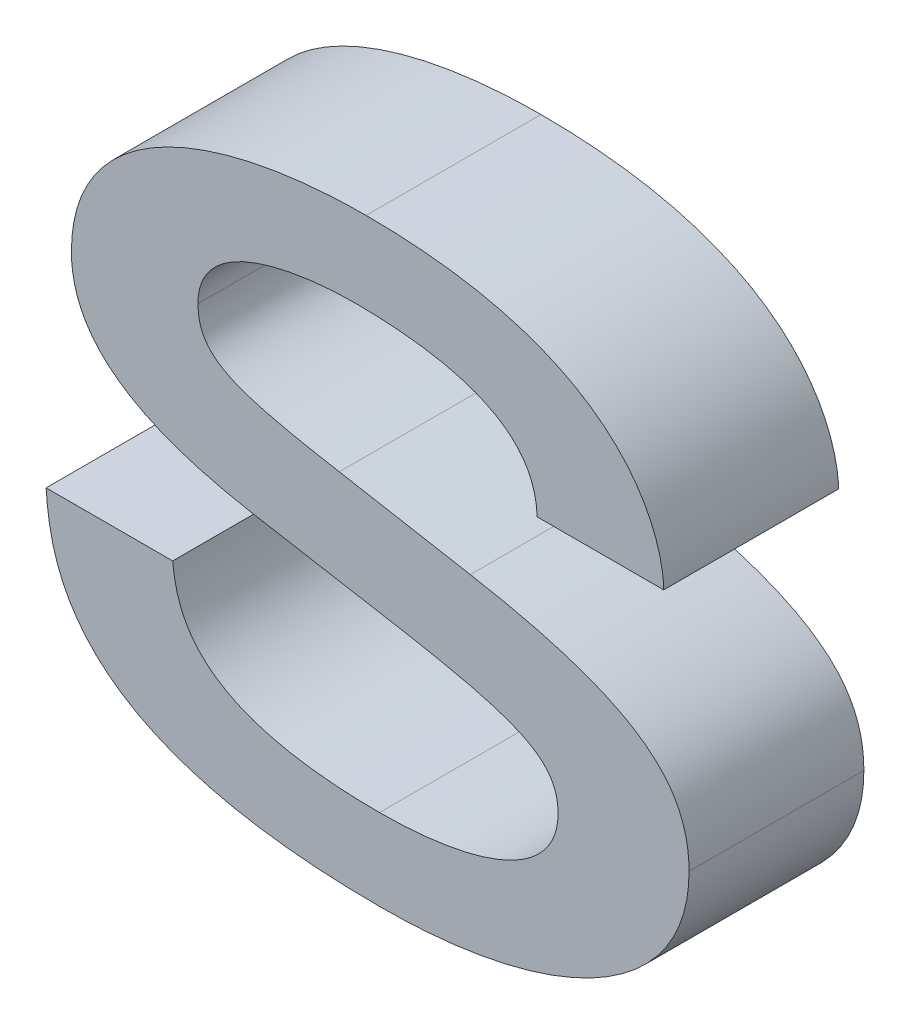
ISO-10303-21;
HEADER;
FILE_DESCRIPTION(('STEP AP214'),'2;1');
FILE_NAME('part.step','',(''),(''),'','','');
FILE_SCHEMA(('AUTOMOTIVE_DESIGN { 1 0 10303 214 1 1 1 1 }'));
ENDSEC;
DATA;
#1=APPLICATION_CONTEXT('core data for automotive mechanical design processes');
#2=APPLICATION_PROTOCOL_DEFINITION('international standard','automotive_design',2000,#1);
#3=PRODUCT_CONTEXT('',#1,'mechanical');
#4=PRODUCT('Part','Part','',(#3));
#5=PRODUCT_RELATED_PRODUCT_CATEGORY('part','',(#4));
#6=PRODUCT_DEFINITION_FORMATION('','',#4);
#7=PRODUCT_DEFINITION_CONTEXT('part definition',#1,'design');
#8=PRODUCT_DEFINITION('design','',#6,#7);
#9=PRODUCT_DEFINITION_SHAPE('','',#8);
#10=(LENGTH_UNIT() NAMED_UNIT(*) SI_UNIT(.MILLI.,.METRE.));
#11=(NAMED_UNIT(*) PLANE_ANGLE_UNIT() SI_UNIT($,.RADIAN.));
#12=(NAMED_UNIT(*) SI_UNIT($,.STERADIAN.) SOLID_ANGLE_UNIT());
#13=UNCERTAINTY_MEASURE_WITH_UNIT(LENGTH_MEASURE(1.E-05),#10,'distance_accuracy_value','');
#14=(GEOMETRIC_REPRESENTATION_CONTEXT(3) GLOBAL_UNCERTAINTY_ASSIGNED_CONTEXT((#13)) GLOBAL_UNIT_ASSIGNED_CONTEXT((#10,
#11,#12)) REPRESENTATION_CONTEXT('',''));
#15=CARTESIAN_POINT('',(0.,0.,0.));
#16=DIRECTION('',(0.,0.,1.));
#17=DIRECTION('',(1.,0.,0.));
#18=AXIS2_PLACEMENT_3D('',#15,#16,#17);
#19=CARTESIAN_POINT('',(24.202356756228,-1.164563334189,19.2));
#20=DIRECTION('',(0.,0.,-1.));
#21=DIRECTION('',(0.,-1.,0.));
#22=AXIS2_PLACEMENT_3D('',#19,#20,#21);
#23=PLANE('',#22);
#24=CARTESIAN_POINT('',(25.169579113635,-0.458206105857,19.2));
#25=CARTESIAN_POINT('',(25.16096286919,-0.256284572523,19.2));
#26=CARTESIAN_POINT('',(25.059154024746,0.0802513163659997,19.2));
#27=CARTESIAN_POINT('',(24.11443206919,0.0802513163659997,19.2));
#28=(BOUNDED_CURVE() B_SPLINE_CURVE(3,(#24,#25,#26,#27),.UNSPECIFIED.,.F.,
.F.) B_SPLINE_CURVE_WITH_KNOTS((4,4),(0.,1.),
.UNSPECIFIED.) CURVE() GEOMETRIC_REPRESENTATION_ITEM() RATIONAL_B_SPLINE_CURVE((1.,1.,1.,1.)) REPRESENTATION_ITEM(''));
#29=CARTESIAN_POINT('',(25.169579113635,-0.458207516968,19.2));
#30=VERTEX_POINT('',#29);
#31=CARTESIAN_POINT('',(24.11443206919,0.0802513163659997,19.2));
#32=VERTEX_POINT('',#31);
#33=EDGE_CURVE('E243',#30,#32,#28,.T.);
#34=ORIENTED_EDGE('',*,*,#33,.T.);
#35=CARTESIAN_POINT('',(24.11443206919,0.0802513163659997,19.2));
#36=CARTESIAN_POINT('',(23.884178246968,0.0802513163659997,19.2));
#37=CARTESIAN_POINT('',(23.228942913635,0.0251446052539999,19.2));
#38=CARTESIAN_POINT('',(23.228942913635,-0.372622216968,19.2));
#39=(BOUNDED_CURVE() B_SPLINE_CURVE(3,(#35,#36,#37,#38),.UNSPECIFIED.,.F.,
.F.) B_SPLINE_CURVE_WITH_KNOTS((4,4),(0.,1.),
.UNSPECIFIED.) CURVE() GEOMETRIC_REPRESENTATION_ITEM() RATIONAL_B_SPLINE_CURVE((1.,1.,1.,1.)) REPRESENTATION_ITEM(''));
#40=CARTESIAN_POINT('',(23.228942913635,-0.372622216968,19.2));
#41=VERTEX_POINT('',#40);
#42=EDGE_CURVE('E223',#32,#41,#39,.T.);
#43=ORIENTED_EDGE('',*,*,#42,.T.);
#44=CARTESIAN_POINT('',(23.228942913635,-0.372622216968,19.2));
#45=CARTESIAN_POINT('',(23.228942913635,-0.635935550301,19.2));
#46=CARTESIAN_POINT('',(23.458666158079,-0.696966105857,19.2));
#47=CARTESIAN_POINT('',(24.037410802523,-0.801108928079,19.2));
#48=(BOUNDED_CURVE() B_SPLINE_CURVE(3,(#44,#45,#46,#47),.UNSPECIFIED.,.F.,
.F.) B_SPLINE_CURVE_WITH_KNOTS((4,4),(0.,1.),
.UNSPECIFIED.) CURVE() GEOMETRIC_REPRESENTATION_ITEM() RATIONAL_B_SPLINE_CURVE((1.,1.,1.,1.)) REPRESENTATION_ITEM(''));
#49=CARTESIAN_POINT('',(24.037410802523,-0.801108928079,19.2));
#50=VERTEX_POINT('',#49);
#51=EDGE_CURVE('E261',#41,#50,#48,.T.);
#52=ORIENTED_EDGE('',*,*,#51,.T.);
#53=DIRECTION('',(0.98427799938062,-0.176626215311554,0.));
#54=VECTOR('',#53,1.);
#55=CARTESIAN_POINT('',(24.037410802523,-0.801108928079,19.2));
#56=LINE('',#55,#54);
#57=CARTESIAN_POINT('',(24.786753135857,-0.935576528079,19.2));
#58=VERTEX_POINT('',#57);
#59=EDGE_CURVE('E217',#50,#58,#56,.T.);
#60=ORIENTED_EDGE('',*,*,#59,.T.);
#61=CARTESIAN_POINT('',(24.786753135857,-0.935576528079,19.2));
#62=CARTESIAN_POINT('',(25.714524824746,-1.100809172523,19.2));
#63=CARTESIAN_POINT('',(26.037965602523,-1.345778061412,19.2));
#64=CARTESIAN_POINT('',(26.037965602523,-1.780233772523,19.2));
#65=(BOUNDED_CURVE() B_SPLINE_CURVE(3,(#61,#62,#63,#64),.UNSPECIFIED.,.F.,
.F.) B_SPLINE_CURVE_WITH_KNOTS((4,4),(0.,1.),
.UNSPECIFIED.) CURVE() GEOMETRIC_REPRESENTATION_ITEM() RATIONAL_B_SPLINE_CURVE((1.,1.,1.,1.)) REPRESENTATION_ITEM(''));
#66=CARTESIAN_POINT('',(26.037965602523,-1.780233772523,19.2));
#67=VERTEX_POINT('',#66);
#68=EDGE_CURVE('E275',#58,#67,#65,.T.);
#69=ORIENTED_EDGE('',*,*,#68,.T.);
#70=CARTESIAN_POINT('',(26.037965602523,-1.780233772523,19.2));
#71=CARTESIAN_POINT('',(26.037965602523,-2.44117563919,19.2));
#72=CARTESIAN_POINT('',(25.280664602523,-2.839108972523,19.2));
#73=CARTESIAN_POINT('',(24.275877291412,-2.839108972523,19.2));
#74=(BOUNDED_CURVE() B_SPLINE_CURVE(3,(#70,#71,#72,#73),.UNSPECIFIED.,.F.,
.F.) B_SPLINE_CURVE_WITH_KNOTS((4,4),(0.,1.),
.UNSPECIFIED.) CURVE() GEOMETRIC_REPRESENTATION_ITEM() RATIONAL_B_SPLINE_CURVE((1.,1.,1.,1.)) REPRESENTATION_ITEM(''));
#75=CARTESIAN_POINT('',(24.275877291412,-2.839108972523,19.2));
#76=VERTEX_POINT('',#75);
#77=EDGE_CURVE('E244',#67,#76,#74,.T.);
#78=ORIENTED_EDGE('',*,*,#77,.T.);
#79=CARTESIAN_POINT('',(24.275877291412,-2.839108972523,19.2));
#80=CARTESIAN_POINT('',(22.513944202523,-2.839108972523,19.2));
#81=CARTESIAN_POINT('',(22.386156802523,-2.104636928079,19.2));
#82=CARTESIAN_POINT('',(22.360567713635,-1.718991550301,19.2));
#83=(BOUNDED_CURVE() B_SPLINE_CURVE(3,(#79,#80,#81,#82),.UNSPECIFIED.,.F.,
.F.) B_SPLINE_CURVE_WITH_KNOTS((4,4),(0.,1.),
.UNSPECIFIED.) CURVE() GEOMETRIC_REPRESENTATION_ITEM() RATIONAL_B_SPLINE_CURVE((1.,1.,1.,1.)) REPRESENTATION_ITEM(''));
#84=CARTESIAN_POINT('',(22.360567713635,-1.718991550301,19.2));
#85=VERTEX_POINT('',#84);
#86=EDGE_CURVE('E283',#76,#85,#83,.T.);
#87=ORIENTED_EDGE('',*,*,#86,.T.);
#88=DIRECTION('',(1.,0.,0.));
#89=VECTOR('',#88,1.);
#90=CARTESIAN_POINT('',(22.360567713635,-1.718991550301,19.2));
#91=LINE('',#90,#89);
#92=CARTESIAN_POINT('',(23.084326602523,-1.718991550301,19.2));
#93=VERTEX_POINT('',#92);
#94=EDGE_CURVE('E263',#85,#93,#91,.T.);
#95=ORIENTED_EDGE('',*,*,#94,.T.);
#96=CARTESIAN_POINT('',(23.084326602523,-1.718991550301,19.2));
#97=CARTESIAN_POINT('',(23.109777402523,-1.969884283634,19.2));
#98=CARTESIAN_POINT('',(23.211851535857,-2.373876928079,19.2));
#99=CARTESIAN_POINT('',(24.267531980301,-2.373876928079,19.2));
#100=(BOUNDED_CURVE() B_SPLINE_CURVE(3,(#96,#97,#98,#99),.UNSPECIFIED.,.F.,
.F.) B_SPLINE_CURVE_WITH_KNOTS((4,4),(0.,1.),
.UNSPECIFIED.) CURVE() GEOMETRIC_REPRESENTATION_ITEM() RATIONAL_B_SPLINE_CURVE((1.,1.,1.,1.)) REPRESENTATION_ITEM(''));
#101=CARTESIAN_POINT('',(24.267531980301,-2.373876928079,19.2));
#102=VERTEX_POINT('',#101);
#103=EDGE_CURVE('E294',#93,#102,#100,.T.);
#104=ORIENTED_EDGE('',*,*,#103,.T.);
#105=CARTESIAN_POINT('',(24.267531980301,-2.373876928079,19.2));
#106=CARTESIAN_POINT('',(24.803861446968,-2.373876928079,19.2));
#107=CARTESIAN_POINT('',(25.288758735857,-2.221064883634,19.2));
#108=CARTESIAN_POINT('',(25.288758735857,-1.865896683634,19.2));
#109=(BOUNDED_CURVE() B_SPLINE_CURVE(3,(#105,#106,#107,#108),.UNSPECIFIED.,.F.,
.F.) B_SPLINE_CURVE_WITH_KNOTS((4,4),(0.,1.),
.UNSPECIFIED.) CURVE() GEOMETRIC_REPRESENTATION_ITEM() RATIONAL_B_SPLINE_CURVE((1.,1.,1.,1.)) REPRESENTATION_ITEM(''));
#110=CARTESIAN_POINT('',(25.288758735857,-1.865896683634,19.2));
#111=VERTEX_POINT('',#110);
#112=EDGE_CURVE('E154',#102,#111,#109,.T.);
#113=ORIENTED_EDGE('',*,*,#112,.T.);
#114=CARTESIAN_POINT('',(25.288758735857,-1.865896683634,19.2));
#115=CARTESIAN_POINT('',(25.288758735857,-1.60894463919,19.2));
#116=CARTESIAN_POINT('',(25.042189646968,-1.523284550301,19.2));
#117=CARTESIAN_POINT('',(24.40366186919,-1.407023105857,19.2));
#118=(BOUNDED_CURVE() B_SPLINE_CURVE(3,(#114,#115,#116,#117),.UNSPECIFIED.,.F.,
.F.) B_SPLINE_CURVE_WITH_KNOTS((4,4),(0.,1.),
.UNSPECIFIED.) CURVE() GEOMETRIC_REPRESENTATION_ITEM() RATIONAL_B_SPLINE_CURVE((1.,1.,1.,1.)) REPRESENTATION_ITEM(''));
#119=CARTESIAN_POINT('',(24.40366186919,-1.407023105857,19.2));
#120=VERTEX_POINT('',#119);
#121=EDGE_CURVE('E215',#111,#120,#118,.T.);
#122=ORIENTED_EDGE('',*,*,#121,.T.);
#123=DIRECTION('',(-0.984774115372703,0.173838838272439,0.));
#124=VECTOR('',#123,1.);
#125=CARTESIAN_POINT('',(24.40366186919,-1.407023105857,19.2));
#126=LINE('',#125,#124);
#127=CARTESIAN_POINT('',(23.535427780301,-1.253756683634,19.2));
#128=VERTEX_POINT('',#127);
#129=EDGE_CURVE('E288',#120,#128,#126,.T.);
#130=ORIENTED_EDGE('',*,*,#129,.T.);
#131=CARTESIAN_POINT('',(23.535427780301,-1.253756683634,19.2));
#132=CARTESIAN_POINT('',(22.913867202523,-1.143706950301,19.2));
#133=CARTESIAN_POINT('',(22.505322313635,-0.917370372523,19.2));
#134=CARTESIAN_POINT('',(22.505322313635,-0.476705772523,19.2));
#135=(BOUNDED_CURVE() B_SPLINE_CURVE(3,(#131,#132,#133,#134),.UNSPECIFIED.,.F.,
.F.) B_SPLINE_CURVE_WITH_KNOTS((4,4),(0.,1.),
.UNSPECIFIED.) CURVE() GEOMETRIC_REPRESENTATION_ITEM() RATIONAL_B_SPLINE_CURVE((1.,1.,1.,1.)) REPRESENTATION_ITEM(''));
#136=CARTESIAN_POINT('',(22.505322313635,-0.476705772523,19.2));
#137=VERTEX_POINT('',#136);
#138=EDGE_CURVE('E20',#128,#137,#135,.T.);
#139=ORIENTED_EDGE('',*,*,#138,.T.);
#140=CARTESIAN_POINT('',(22.505322313635,-0.476705772523,19.2));
#141=CARTESIAN_POINT('',(22.505322313635,0.227060494143,19.2));
#142=CARTESIAN_POINT('',(23.313778913635,0.54548336081,19.2));
#143=CARTESIAN_POINT('',(24.19078446919,0.54548336081,19.2));
#144=(BOUNDED_CURVE() B_SPLINE_CURVE(3,(#140,#141,#142,#143),.UNSPECIFIED.,.F.,
.F.) B_SPLINE_CURVE_WITH_KNOTS((4,4),(0.,1.),
.UNSPECIFIED.) CURVE() GEOMETRIC_REPRESENTATION_ITEM() RATIONAL_B_SPLINE_CURVE((1.,1.,1.,1.)) REPRESENTATION_ITEM(''));
#145=CARTESIAN_POINT('',(24.19078446919,0.54548336081,19.2));
#146=VERTEX_POINT('',#145);
#147=EDGE_CURVE('E190',#137,#146,#144,.T.);
#148=ORIENTED_EDGE('',*,*,#147,.T.);
#149=CARTESIAN_POINT('',(24.19078446919,0.54548336081,19.2));
#150=CARTESIAN_POINT('',(25.782656091412,0.54548336081,19.2));
#151=CARTESIAN_POINT('',(25.893213824746,-0.299187994746,19.2));
#152=CARTESIAN_POINT('',(25.893213824746,-0.458208928079,19.2));
#153=(BOUNDED_CURVE() B_SPLINE_CURVE(3,(#149,#150,#151,#152),.UNSPECIFIED.,.F.,
.F.) B_SPLINE_CURVE_WITH_KNOTS((4,4),(0.,1.),
.UNSPECIFIED.) CURVE() GEOMETRIC_REPRESENTATION_ITEM() RATIONAL_B_SPLINE_CURVE((1.,1.,1.,1.)) REPRESENTATION_ITEM(''));
#154=CARTESIAN_POINT('',(25.893213824746,-0.458208928079,19.2));
#155=VERTEX_POINT('',#154);
#156=EDGE_CURVE('E179',#146,#155,#153,.T.);
#157=ORIENTED_EDGE('',*,*,#156,.T.);
#158=DIRECTION('',(-1.,0.,0.));
#159=VECTOR('',#158,1.);
#160=CARTESIAN_POINT('',(25.893213824746,-0.458208928079,19.2));
#161=LINE('',#160,#159);
#162=EDGE_CURVE('E11',#155,#30,#161,.T.);
#163=ORIENTED_EDGE('',*,*,#162,.T.);
#164=EDGE_LOOP('',(#34,#43,#52,#60,#69,#78,#87,#95,#104,#113,#122,#130,#139,#148,#157,#163));
#165=FACE_BOUND('',#164,.T.);
#166=ADVANCED_FACE('F16',(#165),#23,.T.);
#167=CARTESIAN_POINT('',(24.202356756228,-1.164563334189,20.2));
#168=DIRECTION('',(0.,0.,-1.));
#169=DIRECTION('',(0.,-1.,0.));
#170=AXIS2_PLACEMENT_3D('',#167,#168,#169);
#171=PLANE('',#170);
#172=DIRECTION('',(-1.,0.,0.));
#173=VECTOR('',#172,1.);
#174=CARTESIAN_POINT('',(25.893213824746,-0.458208928079,20.2));
#175=LINE('',#174,#173);
#176=CARTESIAN_POINT('',(25.893213824746,-0.458208928079,20.2));
#177=VERTEX_POINT('',#176);
#178=CARTESIAN_POINT('',(25.169579113635,-0.458207516968,20.2));
#179=VERTEX_POINT('',#178);
#180=EDGE_CURVE('E29',#177,#179,#175,.T.);
#181=ORIENTED_EDGE('',*,*,#180,.F.);
#182=CARTESIAN_POINT('',(24.19078446919,0.54548336081,20.2));
#183=CARTESIAN_POINT('',(25.782656091412,0.54548336081,20.2));
#184=CARTESIAN_POINT('',(25.893213824746,-0.299187994746,20.2));
#185=CARTESIAN_POINT('',(25.893213824746,-0.458208928079,20.2));
#186=(BOUNDED_CURVE() B_SPLINE_CURVE(3,(#182,#183,#184,#185),.UNSPECIFIED.,.F.,
.F.) B_SPLINE_CURVE_WITH_KNOTS((4,4),(0.,1.),
.UNSPECIFIED.) CURVE() GEOMETRIC_REPRESENTATION_ITEM() RATIONAL_B_SPLINE_CURVE((1.,1.,1.,1.)) REPRESENTATION_ITEM(''));
#187=CARTESIAN_POINT('',(24.19078446919,0.54548336081,20.2));
#188=VERTEX_POINT('',#187);
#189=EDGE_CURVE('E196',#188,#177,#186,.T.);
#190=ORIENTED_EDGE('',*,*,#189,.F.);
#191=CARTESIAN_POINT('',(22.505322313635,-0.476705772523,20.2));
#192=CARTESIAN_POINT('',(22.505322313635,0.227060494143,20.2));
#193=CARTESIAN_POINT('',(23.313778913635,0.54548336081,20.2));
#194=CARTESIAN_POINT('',(24.19078446919,0.54548336081,20.2));
#195=(BOUNDED_CURVE() B_SPLINE_CURVE(3,(#191,#192,#193,#194),.UNSPECIFIED.,.F.,
.F.) B_SPLINE_CURVE_WITH_KNOTS((4,4),(0.,1.),
.UNSPECIFIED.) CURVE() GEOMETRIC_REPRESENTATION_ITEM() RATIONAL_B_SPLINE_CURVE((1.,1.,1.,1.)) REPRESENTATION_ITEM(''));
#196=CARTESIAN_POINT('',(22.505322313635,-0.476705772523,20.2));
#197=VERTEX_POINT('',#196);
#198=EDGE_CURVE('E199',#197,#188,#195,.T.);
#199=ORIENTED_EDGE('',*,*,#198,.F.);
#200=CARTESIAN_POINT('',(23.535427780301,-1.253756683634,20.2));
#201=CARTESIAN_POINT('',(22.913867202523,-1.143706950301,20.2));
#202=CARTESIAN_POINT('',(22.505322313635,-0.917370372523,20.2));
#203=CARTESIAN_POINT('',(22.505322313635,-0.476705772523,20.2));
#204=(BOUNDED_CURVE() B_SPLINE_CURVE(3,(#200,#201,#202,#203),.UNSPECIFIED.,.F.,
.F.) B_SPLINE_CURVE_WITH_KNOTS((4,4),(0.,1.),
.UNSPECIFIED.) CURVE() GEOMETRIC_REPRESENTATION_ITEM() RATIONAL_B_SPLINE_CURVE((1.,1.,1.,1.)) REPRESENTATION_ITEM(''));
#205=CARTESIAN_POINT('',(23.535427780301,-1.253756683634,20.2));
#206=VERTEX_POINT('',#205);
#207=EDGE_CURVE('E296',#206,#197,#204,.T.);
#208=ORIENTED_EDGE('',*,*,#207,.F.);
#209=DIRECTION('',(-0.984774115372703,0.173838838272439,0.));
#210=VECTOR('',#209,1.);
#211=CARTESIAN_POINT('',(24.40366186919,-1.407023105857,20.2));
#212=LINE('',#211,#210);
#213=CARTESIAN_POINT('',(24.40366186919,-1.407023105857,20.2));
#214=VERTEX_POINT('',#213);
#215=EDGE_CURVE('E289',#214,#206,#212,.T.);
#216=ORIENTED_EDGE('',*,*,#215,.F.);
#217=CARTESIAN_POINT('',(25.288758735857,-1.865896683634,20.2));
#218=CARTESIAN_POINT('',(25.288758735857,-1.60894463919,20.2));
#219=CARTESIAN_POINT('',(25.042189646968,-1.523284550301,20.2));
#220=CARTESIAN_POINT('',(24.40366186919,-1.407023105857,20.2));
#221=(BOUNDED_CURVE() B_SPLINE_CURVE(3,(#217,#218,#219,#220),.UNSPECIFIED.,.F.,
.F.) B_SPLINE_CURVE_WITH_KNOTS((4,4),(0.,1.),
.UNSPECIFIED.) CURVE() GEOMETRIC_REPRESENTATION_ITEM() RATIONAL_B_SPLINE_CURVE((1.,1.,1.,1.)) REPRESENTATION_ITEM(''));
#222=CARTESIAN_POINT('',(25.288758735857,-1.865896683634,20.2));
#223=VERTEX_POINT('',#222);
#224=EDGE_CURVE('E216',#223,#214,#221,.T.);
#225=ORIENTED_EDGE('',*,*,#224,.F.);
#226=CARTESIAN_POINT('',(24.267531980301,-2.373876928079,20.2));
#227=CARTESIAN_POINT('',(24.803861446968,-2.373876928079,20.2));
#228=CARTESIAN_POINT('',(25.288758735857,-2.221064883634,20.2));
#229=CARTESIAN_POINT('',(25.288758735857,-1.865896683634,20.2));
#230=(BOUNDED_CURVE() B_SPLINE_CURVE(3,(#226,#227,#228,#229),.UNSPECIFIED.,.F.,
.F.) B_SPLINE_CURVE_WITH_KNOTS((4,4),(0.,1.),
.UNSPECIFIED.) CURVE() GEOMETRIC_REPRESENTATION_ITEM() RATIONAL_B_SPLINE_CURVE((1.,1.,1.,1.)) REPRESENTATION_ITEM(''));
#231=CARTESIAN_POINT('',(24.267531980301,-2.373876928079,20.2));
#232=VERTEX_POINT('',#231);
#233=EDGE_CURVE('E145',#232,#223,#230,.T.);
#234=ORIENTED_EDGE('',*,*,#233,.F.);
#235=CARTESIAN_POINT('',(23.084326602523,-1.718991550301,20.2));
#236=CARTESIAN_POINT('',(23.109777402523,-1.969884283634,20.2));
#237=CARTESIAN_POINT('',(23.211851535857,-2.373876928079,20.2));
#238=CARTESIAN_POINT('',(24.267531980301,-2.373876928079,20.2));
#239=(BOUNDED_CURVE() B_SPLINE_CURVE(3,(#235,#236,#237,#238),.UNSPECIFIED.,.F.,
.F.) B_SPLINE_CURVE_WITH_KNOTS((4,4),(0.,1.),
.UNSPECIFIED.) CURVE() GEOMETRIC_REPRESENTATION_ITEM() RATIONAL_B_SPLINE_CURVE((1.,1.,1.,1.)) REPRESENTATION_ITEM(''));
#240=CARTESIAN_POINT('',(23.084326602523,-1.718991550301,20.2));
#241=VERTEX_POINT('',#240);
#242=EDGE_CURVE('E267',#241,#232,#239,.T.);
#243=ORIENTED_EDGE('',*,*,#242,.F.);
#244=DIRECTION('',(1.,0.,0.));
#245=VECTOR('',#244,1.);
#246=CARTESIAN_POINT('',(22.360567713635,-1.718991550301,20.2));
#247=LINE('',#246,#245);
#248=CARTESIAN_POINT('',(22.360567713635,-1.718991550301,20.2));
#249=VERTEX_POINT('',#248);
#250=EDGE_CURVE('E322',#249,#241,#247,.T.);
#251=ORIENTED_EDGE('',*,*,#250,.F.);
#252=CARTESIAN_POINT('',(24.275877291412,-2.839108972523,20.2));
#253=CARTESIAN_POINT('',(22.513944202523,-2.839108972523,20.2));
#254=CARTESIAN_POINT('',(22.386156802523,-2.104636928079,20.2));
#255=CARTESIAN_POINT('',(22.360567713635,-1.718991550301,20.2));
#256=(BOUNDED_CURVE() B_SPLINE_CURVE(3,(#252,#253,#254,#255),.UNSPECIFIED.,.F.,
.F.) B_SPLINE_CURVE_WITH_KNOTS((4,4),(0.,1.),
.UNSPECIFIED.) CURVE() GEOMETRIC_REPRESENTATION_ITEM() RATIONAL_B_SPLINE_CURVE((1.,1.,1.,1.)) REPRESENTATION_ITEM(''));
#257=CARTESIAN_POINT('',(24.275877291412,-2.839108972523,20.2));
#258=VERTEX_POINT('',#257);
#259=EDGE_CURVE('E253',#258,#249,#256,.T.);
#260=ORIENTED_EDGE('',*,*,#259,.F.);
#261=CARTESIAN_POINT('',(26.037965602523,-1.780233772523,20.2));
#262=CARTESIAN_POINT('',(26.037965602523,-2.44117563919,20.2));
#263=CARTESIAN_POINT('',(25.280664602523,-2.839108972523,20.2));
#264=CARTESIAN_POINT('',(24.275877291412,-2.839108972523,20.2));
#265=(BOUNDED_CURVE() B_SPLINE_CURVE(3,(#261,#262,#263,#264),.UNSPECIFIED.,.F.,
.F.) B_SPLINE_CURVE_WITH_KNOTS((4,4),(0.,1.),
.UNSPECIFIED.) CURVE() GEOMETRIC_REPRESENTATION_ITEM() RATIONAL_B_SPLINE_CURVE((1.,1.,1.,1.)) REPRESENTATION_ITEM(''));
#266=CARTESIAN_POINT('',(26.037965602523,-1.780233772523,20.2));
#267=VERTEX_POINT('',#266);
#268=EDGE_CURVE('E269',#267,#258,#265,.T.);
#269=ORIENTED_EDGE('',*,*,#268,.F.);
#270=CARTESIAN_POINT('',(24.786753135857,-0.935576528079,20.2));
#271=CARTESIAN_POINT('',(25.714524824746,-1.100809172523,20.2));
#272=CARTESIAN_POINT('',(26.037965602523,-1.345778061412,20.2));
#273=CARTESIAN_POINT('',(26.037965602523,-1.780233772523,20.2));
#274=(BOUNDED_CURVE() B_SPLINE_CURVE(3,(#270,#271,#272,#273),.UNSPECIFIED.,.F.,
.F.) B_SPLINE_CURVE_WITH_KNOTS((4,4),(0.,1.),
.UNSPECIFIED.) CURVE() GEOMETRIC_REPRESENTATION_ITEM() RATIONAL_B_SPLINE_CURVE((1.,1.,1.,1.)) REPRESENTATION_ITEM(''));
#275=CARTESIAN_POINT('',(24.786753135857,-0.935576528079,20.2));
#276=VERTEX_POINT('',#275);
#277=EDGE_CURVE('E221',#276,#267,#274,.T.);
#278=ORIENTED_EDGE('',*,*,#277,.F.);
#279=DIRECTION('',(0.98427799938062,-0.176626215311554,0.));
#280=VECTOR('',#279,1.);
#281=CARTESIAN_POINT('',(24.037410802523,-0.801108928079,20.2));
#282=LINE('',#281,#280);
#283=CARTESIAN_POINT('',(24.037410802523,-0.801108928079,20.2));
#284=VERTEX_POINT('',#283);
#285=EDGE_CURVE('E356',#284,#276,#282,.T.);
#286=ORIENTED_EDGE('',*,*,#285,.F.);
#287=CARTESIAN_POINT('',(23.228942913635,-0.372622216968,20.2));
#288=CARTESIAN_POINT('',(23.228942913635,-0.635935550301,20.2));
#289=CARTESIAN_POINT('',(23.458666158079,-0.696966105857,20.2));
#290=CARTESIAN_POINT('',(24.037410802523,-0.801108928079,20.2));
#291=(BOUNDED_CURVE() B_SPLINE_CURVE(3,(#287,#288,#289,#290),.UNSPECIFIED.,.F.,
.F.) B_SPLINE_CURVE_WITH_KNOTS((4,4),(0.,1.),
.UNSPECIFIED.) CURVE() GEOMETRIC_REPRESENTATION_ITEM() RATIONAL_B_SPLINE_CURVE((1.,1.,1.,1.)) REPRESENTATION_ITEM(''));
#292=CARTESIAN_POINT('',(23.228942913635,-0.372622216968,20.2));
#293=VERTEX_POINT('',#292);
#294=EDGE_CURVE('E229',#293,#284,#291,.T.);
#295=ORIENTED_EDGE('',*,*,#294,.F.);
#296=CARTESIAN_POINT('',(24.11443206919,0.0802513163659997,20.2));
#297=CARTESIAN_POINT('',(23.884178246968,0.0802513163659997,20.2));
#298=CARTESIAN_POINT('',(23.228942913635,0.0251446052539999,20.2));
#299=CARTESIAN_POINT('',(23.228942913635,-0.372622216968,20.2));
#300=(BOUNDED_CURVE() B_SPLINE_CURVE(3,(#296,#297,#298,#299),.UNSPECIFIED.,.F.,
.F.) B_SPLINE_CURVE_WITH_KNOTS((4,4),(0.,1.),
.UNSPECIFIED.) CURVE() GEOMETRIC_REPRESENTATION_ITEM() RATIONAL_B_SPLINE_CURVE((1.,1.,1.,1.)) REPRESENTATION_ITEM(''));
#301=CARTESIAN_POINT('',(24.11443206919,0.0802513163659997,20.2));
#302=VERTEX_POINT('',#301);
#303=EDGE_CURVE('E237',#302,#293,#300,.T.);
#304=ORIENTED_EDGE('',*,*,#303,.F.);
#305=CARTESIAN_POINT('',(25.169579113635,-0.458206105857,20.2));
#306=CARTESIAN_POINT('',(25.16096286919,-0.256284572523,20.2));
#307=CARTESIAN_POINT('',(25.059154024746,0.0802513163659997,20.2));
#308=CARTESIAN_POINT('',(24.11443206919,0.0802513163659997,20.2));
#309=(BOUNDED_CURVE() B_SPLINE_CURVE(3,(#305,#306,#307,#308),.UNSPECIFIED.,.F.,
.F.) B_SPLINE_CURVE_WITH_KNOTS((4,4),(0.,1.),
.UNSPECIFIED.) CURVE() GEOMETRIC_REPRESENTATION_ITEM() RATIONAL_B_SPLINE_CURVE((1.,1.,1.,1.)) REPRESENTATION_ITEM(''));
#310=EDGE_CURVE('E314',#179,#302,#309,.T.);
#311=ORIENTED_EDGE('',*,*,#310,.F.);
#312=EDGE_LOOP('',(#181,#190,#199,#208,#216,#225,#234,#243,#251,#260,#269,#278,#286,#295,#304,#311));
#313=FACE_BOUND('',#312,.T.);
#314=ADVANCED_FACE('F18',(#313),#171,.F.);
#315=CARTESIAN_POINT('',(25.5313964691905,-0.458208928079,19.19));
#316=DIRECTION('',(0.,1.,0.));
#317=DIRECTION('',(1.,0.,0.));
#318=AXIS2_PLACEMENT_3D('',#315,#316,#317);
#319=PLANE('',#318);
#320=DIRECTION('',(0.,0.,-1.));
#321=VECTOR('',#320,1.);
#322=CARTESIAN_POINT('',(25.893213824746,-0.458208928079,20.2));
#323=LINE('',#322,#321);
#324=EDGE_CURVE('E186',#177,#155,#323,.T.);
#325=ORIENTED_EDGE('',*,*,#324,.F.);
#326=ORIENTED_EDGE('',*,*,#180,.T.);
#327=DIRECTION('',(0.,0.,-1.));
#328=VECTOR('',#327,1.);
#329=CARTESIAN_POINT('',(25.169579113635,-0.458206105857,20.2));
#330=LINE('',#329,#328);
#331=EDGE_CURVE('E321',#179,#30,#330,.T.);
#332=ORIENTED_EDGE('',*,*,#331,.T.);
#333=ORIENTED_EDGE('',*,*,#162,.F.);
#334=EDGE_LOOP('',(#325,#326,#332,#333));
#335=FACE_BOUND('',#334,.T.);
#336=ADVANCED_FACE('F501',(#335),#319,.F.);
#337=CARTESIAN_POINT('',(24.19078446919,0.54548336081,19.1979038399138));
#338=CARTESIAN_POINT('',(24.19078446919,0.54548336081,20.2020961600862));
#339=CARTESIAN_POINT('',(25.782656091412,0.54548336081,19.1979038399138));
#340=CARTESIAN_POINT('',(25.782656091412,0.54548336081,20.2020961600862));
#341=CARTESIAN_POINT('',(25.893213824746,-0.299187994746,19.1979038399138));
#342=CARTESIAN_POINT('',(25.893213824746,-0.299187994746,20.2020961600862));
#343=CARTESIAN_POINT('',(25.893213824746,-0.458208928079,19.1979038399138));
#344=CARTESIAN_POINT('',(25.893213824746,-0.458208928079,20.2020961600862));
#345=(BOUNDED_SURFACE() B_SPLINE_SURFACE(3,1,((#337,#338),(#339,#340),(#341,#342),(#343,#344)),
.UNSPECIFIED.,.F.,.F.,.F.) B_SPLINE_SURFACE_WITH_KNOTS((4,4),(2,2),(0.,1.),(-1.00209616008627,
0.00209616008626557),
.UNSPECIFIED.) GEOMETRIC_REPRESENTATION_ITEM() RATIONAL_B_SPLINE_SURFACE(((1.,1.),(1.,1.),(1.,
1.),(1.,1.))) REPRESENTATION_ITEM('') SURFACE());
#346=DIRECTION('',(0.,0.,-1.));
#347=VECTOR('',#346,1.);
#348=CARTESIAN_POINT('',(24.19078446919,0.54548336081,20.2));
#349=LINE('',#348,#347);
#350=EDGE_CURVE('E184',#188,#146,#349,.T.);
#351=ORIENTED_EDGE('',*,*,#350,.F.);
#352=ORIENTED_EDGE('',*,*,#189,.T.);
#353=ORIENTED_EDGE('',*,*,#324,.T.);
#354=ORIENTED_EDGE('',*,*,#156,.F.);
#355=EDGE_LOOP('',(#351,#352,#353,#354));
#356=FACE_BOUND('',#355,.T.);
#357=ADVANCED_FACE('F181',(#356),#345,.F.);
#358=CARTESIAN_POINT('',(22.505322313635,-0.476705772523,19.199));
#359=CARTESIAN_POINT('',(22.505322313635,-0.476705772523,20.201));
#360=CARTESIAN_POINT('',(22.505322313635,0.227060494143,19.199));
#361=CARTESIAN_POINT('',(22.505322313635,0.227060494143,20.201));
#362=CARTESIAN_POINT('',(23.313778913635,0.54548336081,19.199));
#363=CARTESIAN_POINT('',(23.313778913635,0.54548336081,20.201));
#364=CARTESIAN_POINT('',(24.19078446919,0.54548336081,19.199));
#365=CARTESIAN_POINT('',(24.19078446919,0.54548336081,20.201));
#366=(BOUNDED_SURFACE() B_SPLINE_SURFACE(3,1,((#358,#359),(#360,#361),(#362,#363),(#364,#365)),
.UNSPECIFIED.,.F.,.F.,.F.) B_SPLINE_SURFACE_WITH_KNOTS((4,4),(2,2),(0.,1.),(-1.001,0.001),
.UNSPECIFIED.) GEOMETRIC_REPRESENTATION_ITEM() RATIONAL_B_SPLINE_SURFACE(((1.,1.),(1.,1.),(1.,
1.),(1.,1.))) REPRESENTATION_ITEM('') SURFACE());
#367=DIRECTION('',(0.,0.,-1.));
#368=VECTOR('',#367,1.);
#369=CARTESIAN_POINT('',(22.505322313635,-0.476705772523,20.2));
#370=LINE('',#369,#368);
#371=EDGE_CURVE('E379',#197,#137,#370,.T.);
#372=ORIENTED_EDGE('',*,*,#371,.F.);
#373=ORIENTED_EDGE('',*,*,#198,.T.);
#374=ORIENTED_EDGE('',*,*,#350,.T.);
#375=ORIENTED_EDGE('',*,*,#147,.F.);
#376=EDGE_LOOP('',(#372,#373,#374,#375));
#377=FACE_BOUND('',#376,.T.);
#378=ADVANCED_FACE('F198',(#377),#366,.F.);
#379=CARTESIAN_POINT('',(23.535427780301,-1.253756683634,19.199));
#380=CARTESIAN_POINT('',(23.535427780301,-1.253756683634,20.201));
#381=CARTESIAN_POINT('',(22.913867202523,-1.143706950301,19.199));
#382=CARTESIAN_POINT('',(22.913867202523,-1.143706950301,20.201));
#383=CARTESIAN_POINT('',(22.505322313635,-0.917370372523,19.199));
#384=CARTESIAN_POINT('',(22.505322313635,-0.917370372523,20.201));
#385=CARTESIAN_POINT('',(22.505322313635,-0.476705772523,19.199));
#386=CARTESIAN_POINT('',(22.505322313635,-0.476705772523,20.201));
#387=(BOUNDED_SURFACE() B_SPLINE_SURFACE(3,1,((#379,#380),(#381,#382),(#383,#384),(#385,#386)),
.UNSPECIFIED.,.F.,.F.,.F.) B_SPLINE_SURFACE_WITH_KNOTS((4,4),(2,2),(0.,1.),(-1.001,0.001),
.UNSPECIFIED.) GEOMETRIC_REPRESENTATION_ITEM() RATIONAL_B_SPLINE_SURFACE(((1.,1.),(1.,1.),(1.,
1.),(1.,1.))) REPRESENTATION_ITEM('') SURFACE());
#388=DIRECTION('',(0.,0.,-1.));
#389=VECTOR('',#388,1.);
#390=CARTESIAN_POINT('',(23.535427780301,-1.253756683634,20.2));
#391=LINE('',#390,#389);
#392=EDGE_CURVE('E284',#206,#128,#391,.T.);
#393=ORIENTED_EDGE('',*,*,#392,.F.);
#394=ORIENTED_EDGE('',*,*,#207,.T.);
#395=ORIENTED_EDGE('',*,*,#371,.T.);
#396=ORIENTED_EDGE('',*,*,#138,.F.);
#397=EDGE_LOOP('',(#393,#394,#395,#396));
#398=FACE_BOUND('',#397,.T.);
#399=ADVANCED_FACE('F435',(#398),#387,.F.);
#400=CARTESIAN_POINT('',(23.9695448247455,-1.3303898947455,19.19));
#401=DIRECTION('',(0.173838838272439,0.984774115372703,0.));
#402=DIRECTION('',(0.,0.,-1.));
#403=AXIS2_PLACEMENT_3D('',#400,#401,#402);
#404=PLANE('',#403);
#405=DIRECTION('',(0.,0.,-1.));
#406=VECTOR('',#405,1.);
#407=CARTESIAN_POINT('',(24.40366186919,-1.407023105857,20.2));
#408=LINE('',#407,#406);
#409=EDGE_CURVE('E211',#214,#120,#408,.T.);
#410=ORIENTED_EDGE('',*,*,#409,.F.);
#411=ORIENTED_EDGE('',*,*,#215,.T.);
#412=ORIENTED_EDGE('',*,*,#392,.T.);
#413=ORIENTED_EDGE('',*,*,#129,.F.);
#414=EDGE_LOOP('',(#410,#411,#412,#413));
#415=FACE_BOUND('',#414,.T.);
#416=ADVANCED_FACE('F440',(#415),#404,.F.);
#417=CARTESIAN_POINT('',(25.288758735857,-1.865896683634,19.1987027410735));
#418=CARTESIAN_POINT('',(25.288758735857,-1.865896683634,20.2012972589265));
#419=CARTESIAN_POINT('',(25.288758735857,-1.60894463919,19.1987027410735));
#420=CARTESIAN_POINT('',(25.288758735857,-1.60894463919,20.2012972589265));
#421=CARTESIAN_POINT('',(25.042189646968,-1.523284550301,19.1987027410735));
#422=CARTESIAN_POINT('',(25.042189646968,-1.523284550301,20.2012972589265));
#423=CARTESIAN_POINT('',(24.40366186919,-1.407023105857,19.1987027410735));
#424=CARTESIAN_POINT('',(24.40366186919,-1.407023105857,20.2012972589265));
#425=(BOUNDED_SURFACE() B_SPLINE_SURFACE(3,1,((#417,#418),(#419,#420),(#421,#422),(#423,#424)),
.UNSPECIFIED.,.F.,.F.,.F.) B_SPLINE_SURFACE_WITH_KNOTS((4,4),(2,2),(0.,1.),(-1.00129725892648,
0.00129725892648416),
.UNSPECIFIED.) GEOMETRIC_REPRESENTATION_ITEM() RATIONAL_B_SPLINE_SURFACE(((1.,1.),(1.,1.),(1.,
1.),(1.,1.))) REPRESENTATION_ITEM('') SURFACE());
#426=DIRECTION('',(0.,0.,-1.));
#427=VECTOR('',#426,1.);
#428=CARTESIAN_POINT('',(25.288758735857,-1.865896683634,20.2));
#429=LINE('',#428,#427);
#430=EDGE_CURVE('E308',#223,#111,#429,.T.);
#431=ORIENTED_EDGE('',*,*,#430,.F.);
#432=ORIENTED_EDGE('',*,*,#224,.T.);
#433=ORIENTED_EDGE('',*,*,#409,.T.);
#434=ORIENTED_EDGE('',*,*,#121,.F.);
#435=EDGE_LOOP('',(#431,#432,#433,#434));
#436=FACE_BOUND('',#435,.T.);
#437=ADVANCED_FACE('F471',(#436),#425,.F.);
#438=CARTESIAN_POINT('',(24.267531980301,-2.373876928079,19.199));
#439=CARTESIAN_POINT('',(24.267531980301,-2.373876928079,20.201));
#440=CARTESIAN_POINT('',(24.803861446968,-2.373876928079,19.199));
#441=CARTESIAN_POINT('',(24.803861446968,-2.373876928079,20.201));
#442=CARTESIAN_POINT('',(25.288758735857,-2.221064883634,19.199));
#443=CARTESIAN_POINT('',(25.288758735857,-2.221064883634,20.201));
#444=CARTESIAN_POINT('',(25.288758735857,-1.865896683634,19.199));
#445=CARTESIAN_POINT('',(25.288758735857,-1.865896683634,20.201));
#446=(BOUNDED_SURFACE() B_SPLINE_SURFACE(3,1,((#438,#439),(#440,#441),(#442,#443),(#444,#445)),
.UNSPECIFIED.,.F.,.F.,.F.) B_SPLINE_SURFACE_WITH_KNOTS((4,4),(2,2),(0.,1.),(-1.001,0.001),
.UNSPECIFIED.) GEOMETRIC_REPRESENTATION_ITEM() RATIONAL_B_SPLINE_SURFACE(((1.,1.),(1.,1.),(1.,
1.),(1.,1.))) REPRESENTATION_ITEM('') SURFACE());
#447=DIRECTION('',(0.,0.,-1.));
#448=VECTOR('',#447,1.);
#449=CARTESIAN_POINT('',(24.267531980301,-2.373876928079,20.2));
#450=LINE('',#449,#448);
#451=EDGE_CURVE('E290',#232,#102,#450,.T.);
#452=ORIENTED_EDGE('',*,*,#451,.F.);
#453=ORIENTED_EDGE('',*,*,#233,.T.);
#454=ORIENTED_EDGE('',*,*,#430,.T.);
#455=ORIENTED_EDGE('',*,*,#112,.F.);
#456=EDGE_LOOP('',(#452,#453,#454,#455));
#457=FACE_BOUND('',#456,.T.);
#458=ADVANCED_FACE('F450',(#457),#446,.F.);
#459=CARTESIAN_POINT('',(23.084326602523,-1.718991550301,19.1986781944304));
#460=CARTESIAN_POINT('',(23.084326602523,-1.718991550301,20.2013218055695));
#461=CARTESIAN_POINT('',(23.109777402523,-1.969884283634,19.1986781944304));
#462=CARTESIAN_POINT('',(23.109777402523,-1.969884283634,20.2013218055695));
#463=CARTESIAN_POINT('',(23.211851535857,-2.373876928079,19.1986781944304));
#464=CARTESIAN_POINT('',(23.211851535857,-2.373876928079,20.2013218055695));
#465=CARTESIAN_POINT('',(24.267531980301,-2.373876928079,19.1986781944304));
#466=CARTESIAN_POINT('',(24.267531980301,-2.373876928079,20.2013218055695));
#467=(BOUNDED_SURFACE() B_SPLINE_SURFACE(3,1,((#459,#460),(#461,#462),(#463,#464),(#465,#466)),
.UNSPECIFIED.,.F.,.F.,.F.) B_SPLINE_SURFACE_WITH_KNOTS((4,4),(2,2),(0.,1.),(-1.00132180556956,
0.00132180556955915),
.UNSPECIFIED.) GEOMETRIC_REPRESENTATION_ITEM() RATIONAL_B_SPLINE_SURFACE(((1.,1.),(1.,1.),(1.,
1.),(1.,1.))) REPRESENTATION_ITEM('') SURFACE());
#468=DIRECTION('',(0.,0.,-1.));
#469=VECTOR('',#468,1.);
#470=CARTESIAN_POINT('',(23.084326602523,-1.718991550301,20.2));
#471=LINE('',#470,#469);
#472=EDGE_CURVE('E268',#241,#93,#471,.T.);
#473=ORIENTED_EDGE('',*,*,#472,.F.);
#474=ORIENTED_EDGE('',*,*,#242,.T.);
#475=ORIENTED_EDGE('',*,*,#451,.T.);
#476=ORIENTED_EDGE('',*,*,#103,.F.);
#477=EDGE_LOOP('',(#473,#474,#475,#476));
#478=FACE_BOUND('',#477,.T.);
#479=ADVANCED_FACE('F427',(#478),#467,.F.);
#480=CARTESIAN_POINT('',(22.722447158079,-1.718991550301,19.19));
#481=DIRECTION('',(0.,-1.,0.));
#482=DIRECTION('',(0.,0.,-1.));
#483=AXIS2_PLACEMENT_3D('',#480,#481,#482);
#484=PLANE('',#483);
#485=DIRECTION('',(0.,0.,-1.));
#486=VECTOR('',#485,1.);
#487=CARTESIAN_POINT('',(22.360567713635,-1.718991550301,20.2));
#488=LINE('',#487,#486);
#489=EDGE_CURVE('E276',#249,#85,#488,.T.);
#490=ORIENTED_EDGE('',*,*,#489,.F.);
#491=ORIENTED_EDGE('',*,*,#250,.T.);
#492=ORIENTED_EDGE('',*,*,#472,.T.);
#493=ORIENTED_EDGE('',*,*,#94,.F.);
#494=EDGE_LOOP('',(#490,#491,#492,#493));
#495=FACE_BOUND('',#494,.T.);
#496=ADVANCED_FACE('F421',(#495),#484,.F.);
#497=CARTESIAN_POINT('',(24.275877291412,-2.839108972523,19.199));
#498=CARTESIAN_POINT('',(24.275877291412,-2.839108972523,20.201));
#499=CARTESIAN_POINT('',(22.513944202523,-2.839108972523,19.199));
#500=CARTESIAN_POINT('',(22.513944202523,-2.839108972523,20.201));
#501=CARTESIAN_POINT('',(22.386156802523,-2.104636928079,19.199));
#502=CARTESIAN_POINT('',(22.386156802523,-2.104636928079,20.201));
#503=CARTESIAN_POINT('',(22.360567713635,-1.718991550301,19.199));
#504=CARTESIAN_POINT('',(22.360567713635,-1.718991550301,20.201));
#505=(BOUNDED_SURFACE() B_SPLINE_SURFACE(3,1,((#497,#498),(#499,#500),(#501,#502),(#503,#504)),
.UNSPECIFIED.,.F.,.F.,.F.) B_SPLINE_SURFACE_WITH_KNOTS((4,4),(2,2),(0.,1.),(-1.001,0.001),
.UNSPECIFIED.) GEOMETRIC_REPRESENTATION_ITEM() RATIONAL_B_SPLINE_SURFACE(((1.,1.),(1.,1.),(1.,
1.),(1.,1.))) REPRESENTATION_ITEM('') SURFACE());
#506=DIRECTION('',(0.,0.,-1.));
#507=VECTOR('',#506,1.);
#508=CARTESIAN_POINT('',(24.275877291412,-2.839108972523,20.2));
#509=LINE('',#508,#507);
#510=EDGE_CURVE('E254',#258,#76,#509,.T.);
#511=ORIENTED_EDGE('',*,*,#510,.F.);
#512=ORIENTED_EDGE('',*,*,#259,.T.);
#513=ORIENTED_EDGE('',*,*,#489,.T.);
#514=ORIENTED_EDGE('',*,*,#86,.F.);
#515=EDGE_LOOP('',(#511,#512,#513,#514));
#516=FACE_BOUND('',#515,.T.);
#517=ADVANCED_FACE('F426',(#516),#505,.F.);
#518=CARTESIAN_POINT('',(26.037965602523,-1.780233772523,19.199));
#519=CARTESIAN_POINT('',(26.037965602523,-1.780233772523,20.201));
#520=CARTESIAN_POINT('',(26.037965602523,-2.44117563919,19.199));
#521=CARTESIAN_POINT('',(26.037965602523,-2.44117563919,20.201));
#522=CARTESIAN_POINT('',(25.280664602523,-2.839108972523,19.199));
#523=CARTESIAN_POINT('',(25.280664602523,-2.839108972523,20.201));
#524=CARTESIAN_POINT('',(24.275877291412,-2.839108972523,19.199));
#525=CARTESIAN_POINT('',(24.275877291412,-2.839108972523,20.201));
#526=(BOUNDED_SURFACE() B_SPLINE_SURFACE(3,1,((#518,#519),(#520,#521),(#522,#523),(#524,#525)),
.UNSPECIFIED.,.F.,.F.,.F.) B_SPLINE_SURFACE_WITH_KNOTS((4,4),(2,2),(0.,1.),(-1.001,0.001),
.UNSPECIFIED.) GEOMETRIC_REPRESENTATION_ITEM() RATIONAL_B_SPLINE_SURFACE(((1.,1.),(1.,1.),(1.,
1.),(1.,1.))) REPRESENTATION_ITEM('') SURFACE());
#527=DIRECTION('',(0.,0.,-1.));
#528=VECTOR('',#527,1.);
#529=CARTESIAN_POINT('',(26.037965602523,-1.780233772523,20.2));
#530=LINE('',#529,#528);
#531=EDGE_CURVE('E209',#267,#67,#530,.T.);
#532=ORIENTED_EDGE('',*,*,#531,.F.);
#533=ORIENTED_EDGE('',*,*,#268,.T.);
#534=ORIENTED_EDGE('',*,*,#510,.T.);
#535=ORIENTED_EDGE('',*,*,#77,.F.);
#536=EDGE_LOOP('',(#532,#533,#534,#535));
#537=FACE_BOUND('',#536,.T.);
#538=ADVANCED_FACE('F463',(#537),#526,.F.);
#539=CARTESIAN_POINT('',(24.786753135857,-0.935576528079,19.199));
#540=CARTESIAN_POINT('',(24.786753135857,-0.935576528079,20.201));
#541=CARTESIAN_POINT('',(25.714524824746,-1.100809172523,19.199));
#542=CARTESIAN_POINT('',(25.714524824746,-1.100809172523,20.201));
#543=CARTESIAN_POINT('',(26.037965602523,-1.345778061412,19.199));
#544=CARTESIAN_POINT('',(26.037965602523,-1.345778061412,20.201));
#545=CARTESIAN_POINT('',(26.037965602523,-1.780233772523,19.199));
#546=CARTESIAN_POINT('',(26.037965602523,-1.780233772523,20.201));
#547=(BOUNDED_SURFACE() B_SPLINE_SURFACE(3,1,((#539,#540),(#541,#542),(#543,#544),(#545,#546)),
.UNSPECIFIED.,.F.,.F.,.F.) B_SPLINE_SURFACE_WITH_KNOTS((4,4),(2,2),(0.,1.),(-1.001,0.001),
.UNSPECIFIED.) GEOMETRIC_REPRESENTATION_ITEM() RATIONAL_B_SPLINE_SURFACE(((1.,1.),(1.,1.),(1.,
1.),(1.,1.))) REPRESENTATION_ITEM('') SURFACE());
#548=DIRECTION('',(0.,0.,-1.));
#549=VECTOR('',#548,1.);
#550=CARTESIAN_POINT('',(24.786753135857,-0.935576528079,20.2));
#551=LINE('',#550,#549);
#552=EDGE_CURVE('E222',#276,#58,#551,.T.);
#553=ORIENTED_EDGE('',*,*,#552,.F.);
#554=ORIENTED_EDGE('',*,*,#277,.T.);
#555=ORIENTED_EDGE('',*,*,#531,.T.);
#556=ORIENTED_EDGE('',*,*,#68,.F.);
#557=EDGE_LOOP('',(#553,#554,#555,#556));
#558=FACE_BOUND('',#557,.T.);
#559=ADVANCED_FACE('F457',(#558),#547,.F.);
#560=CARTESIAN_POINT('',(24.41208196919,-0.868342728079,19.19));
#561=DIRECTION('',(-0.176626215311553,-0.984277999380621,0.));
#562=DIRECTION('',(-0.984277999380621,0.176626215311553,0.));
#563=AXIS2_PLACEMENT_3D('',#560,#561,#562);
#564=PLANE('',#563);
#565=DIRECTION('',(0.,0.,-1.));
#566=VECTOR('',#565,1.);
#567=CARTESIAN_POINT('',(24.037410802523,-0.801108928079,20.2));
#568=LINE('',#567,#566);
#569=EDGE_CURVE('E255',#284,#50,#568,.T.);
#570=ORIENTED_EDGE('',*,*,#569,.F.);
#571=ORIENTED_EDGE('',*,*,#285,.T.);
#572=ORIENTED_EDGE('',*,*,#552,.T.);
#573=ORIENTED_EDGE('',*,*,#59,.F.);
#574=EDGE_LOOP('',(#570,#571,#572,#573));
#575=FACE_BOUND('',#574,.T.);
#576=ADVANCED_FACE('F462',(#575),#564,.F.);
#577=CARTESIAN_POINT('',(23.228942913635,-0.372622216968,19.1987340810695));
#578=CARTESIAN_POINT('',(23.228942913635,-0.372622216968,20.2012659189305));
#579=CARTESIAN_POINT('',(23.228942913635,-0.635935550301,19.1987340810695));
#580=CARTESIAN_POINT('',(23.228942913635,-0.635935550301,20.2012659189305));
#581=CARTESIAN_POINT('',(23.458666158079,-0.696966105857,19.1987340810695));
#582=CARTESIAN_POINT('',(23.458666158079,-0.696966105857,20.2012659189305));
#583=CARTESIAN_POINT('',(24.037410802523,-0.801108928079,19.1987340810695));
#584=CARTESIAN_POINT('',(24.037410802523,-0.801108928079,20.2012659189305));
#585=(BOUNDED_SURFACE() B_SPLINE_SURFACE(3,1,((#577,#578),(#579,#580),(#581,#582),(#583,#584)),
.UNSPECIFIED.,.F.,.F.,.F.) B_SPLINE_SURFACE_WITH_KNOTS((4,4),(2,2),(0.,1.),(-1.00126591893055,
0.00126591893055329),
.UNSPECIFIED.) GEOMETRIC_REPRESENTATION_ITEM() RATIONAL_B_SPLINE_SURFACE(((1.,1.),(1.,1.),(1.,
1.),(1.,1.))) REPRESENTATION_ITEM('') SURFACE());
#586=DIRECTION('',(0.,0.,-1.));
#587=VECTOR('',#586,1.);
#588=CARTESIAN_POINT('',(23.228942913635,-0.372622216968,20.2));
#589=LINE('',#588,#587);
#590=EDGE_CURVE('E230',#293,#41,#589,.T.);
#591=ORIENTED_EDGE('',*,*,#590,.F.);
#592=ORIENTED_EDGE('',*,*,#294,.T.);
#593=ORIENTED_EDGE('',*,*,#569,.T.);
#594=ORIENTED_EDGE('',*,*,#51,.F.);
#595=EDGE_LOOP('',(#591,#592,#593,#594));
#596=FACE_BOUND('',#595,.T.);
#597=ADVANCED_FACE('F412',(#596),#585,.F.);
#598=CARTESIAN_POINT('',(24.11443206919,0.0802513163659997,19.1985523222585));
#599=CARTESIAN_POINT('',(24.11443206919,0.0802513163659997,20.2014476777416));
#600=CARTESIAN_POINT('',(23.884178246968,0.0802513163659997,19.1985523222585));
#601=CARTESIAN_POINT('',(23.884178246968,0.0802513163659997,20.2014476777416));
#602=CARTESIAN_POINT('',(23.228942913635,0.0251446052539999,19.1985523222585));
#603=CARTESIAN_POINT('',(23.228942913635,0.0251446052539999,20.2014476777416));
#604=CARTESIAN_POINT('',(23.228942913635,-0.372622216968,19.1985523222585));
#605=CARTESIAN_POINT('',(23.228942913635,-0.372622216968,20.2014476777416));
#606=(BOUNDED_SURFACE() B_SPLINE_SURFACE(3,1,((#598,#599),(#600,#601),(#602,#603),(#604,#605)),
.UNSPECIFIED.,.F.,.F.,.F.) B_SPLINE_SURFACE_WITH_KNOTS((4,4),(2,2),(0.,1.),(-1.00144767774153,
0.00144767774153147),
.UNSPECIFIED.) GEOMETRIC_REPRESENTATION_ITEM() RATIONAL_B_SPLINE_SURFACE(((1.,1.),(1.,1.),(1.,
1.),(1.,1.))) REPRESENTATION_ITEM('') SURFACE());
#607=DIRECTION('',(0.,0.,-1.));
#608=VECTOR('',#607,1.);
#609=CARTESIAN_POINT('',(24.11443206919,0.0802513163659997,20.2));
#610=LINE('',#609,#608);
#611=EDGE_CURVE('E320',#302,#32,#610,.T.);
#612=ORIENTED_EDGE('',*,*,#611,.F.);
#613=ORIENTED_EDGE('',*,*,#303,.T.);
#614=ORIENTED_EDGE('',*,*,#590,.T.);
#615=ORIENTED_EDGE('',*,*,#42,.F.);
#616=EDGE_LOOP('',(#612,#613,#614,#615));
#617=FACE_BOUND('',#616,.T.);
#618=ADVANCED_FACE('F406',(#617),#606,.F.);
#619=CARTESIAN_POINT('',(25.169579113635,-0.458206105857,19.1983506946038));
#620=CARTESIAN_POINT('',(25.169579113635,-0.458206105857,20.2016493053961));
#621=CARTESIAN_POINT('',(25.16096286919,-0.256284572523,19.1983506946038));
#622=CARTESIAN_POINT('',(25.16096286919,-0.256284572523,20.2016493053961));
#623=CARTESIAN_POINT('',(25.059154024746,0.0802513163659997,19.1983506946038));
#624=CARTESIAN_POINT('',(25.059154024746,0.0802513163659997,20.2016493053961));
#625=CARTESIAN_POINT('',(24.11443206919,0.0802513163659997,19.1983506946038));
#626=CARTESIAN_POINT('',(24.11443206919,0.0802513163659997,20.2016493053961));
#627=(BOUNDED_SURFACE() B_SPLINE_SURFACE(3,1,((#619,#620),(#621,#622),(#623,#624),(#625,#626)),
.UNSPECIFIED.,.F.,.F.,.F.) B_SPLINE_SURFACE_WITH_KNOTS((4,4),(2,2),(0.,1.),(-1.00164930539614,
0.00164930539613945),
.UNSPECIFIED.) GEOMETRIC_REPRESENTATION_ITEM() RATIONAL_B_SPLINE_SURFACE(((1.,1.),(1.,1.),(1.,
1.),(1.,1.))) REPRESENTATION_ITEM('') SURFACE());
#628=ORIENTED_EDGE('',*,*,#331,.F.);
#629=ORIENTED_EDGE('',*,*,#310,.T.);
#630=ORIENTED_EDGE('',*,*,#611,.T.);
#631=ORIENTED_EDGE('',*,*,#33,.F.);
#632=EDGE_LOOP('',(#628,#629,#630,#631));
#633=FACE_BOUND('',#632,.T.);
#634=ADVANCED_FACE('F411',(#633),#627,.F.);
#635=CLOSED_SHELL('',(#166,#314,#336,#357,#378,#399,#416,#437,#458,#479,#496,#517,#538,#559,
#576,#597,#618,#634));
#636=MANIFOLD_SOLID_BREP('B1',#635);
#637=ADVANCED_BREP_SHAPE_REPRESENTATION('',(#18,#636),#14);
#638=SHAPE_DEFINITION_REPRESENTATION(#9,#637);
ENDSEC;
END-ISO-10303-21;
